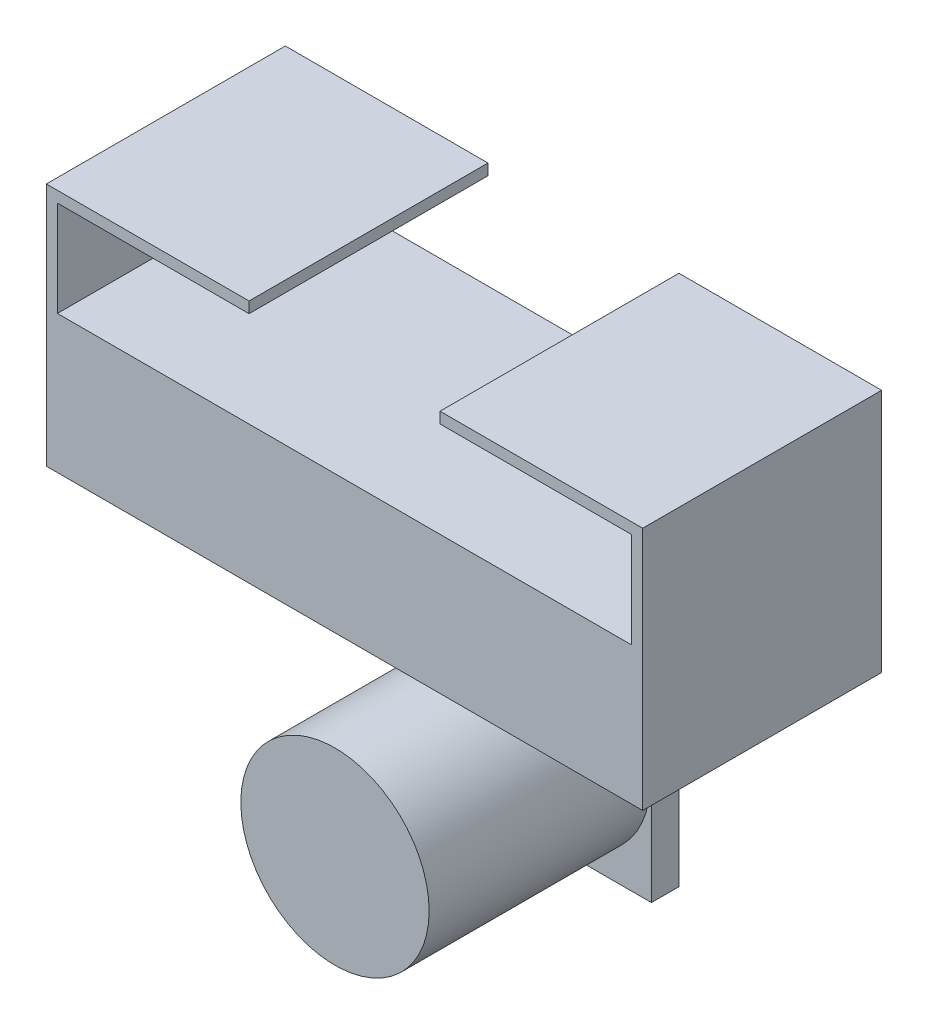
ISO-10303-21;
HEADER;
FILE_DESCRIPTION(('STEP AP214'),'2;1');
FILE_NAME('part.step','',(''),(''),'','','');
FILE_SCHEMA(('AUTOMOTIVE_DESIGN { 1 0 10303 214 1 1 1 1 }'));
ENDSEC;
DATA;
#1=APPLICATION_CONTEXT('core data for automotive mechanical design processes');
#2=APPLICATION_PROTOCOL_DEFINITION('international standard','automotive_design',2000,#1);
#3=PRODUCT_CONTEXT('',#1,'mechanical');
#4=PRODUCT('Part','Part','',(#3));
#5=PRODUCT_RELATED_PRODUCT_CATEGORY('part','',(#4));
#6=PRODUCT_DEFINITION_FORMATION('','',#4);
#7=PRODUCT_DEFINITION_CONTEXT('part definition',#1,'design');
#8=PRODUCT_DEFINITION('design','',#6,#7);
#9=PRODUCT_DEFINITION_SHAPE('','',#8);
#10=(LENGTH_UNIT() NAMED_UNIT(*) SI_UNIT(.MILLI.,.METRE.));
#11=(NAMED_UNIT(*) PLANE_ANGLE_UNIT() SI_UNIT($,.RADIAN.));
#12=(NAMED_UNIT(*) SI_UNIT($,.STERADIAN.) SOLID_ANGLE_UNIT());
#13=UNCERTAINTY_MEASURE_WITH_UNIT(LENGTH_MEASURE(1.E-05),#10,'distance_accuracy_value','');
#14=(GEOMETRIC_REPRESENTATION_CONTEXT(3) GLOBAL_UNCERTAINTY_ASSIGNED_CONTEXT((#13)) GLOBAL_UNIT_ASSIGNED_CONTEXT((#10,
#11,#12)) REPRESENTATION_CONTEXT('',''));
#15=CARTESIAN_POINT('',(0.,0.,0.));
#16=DIRECTION('',(0.,0.,1.));
#17=DIRECTION('',(1.,0.,0.));
#18=AXIS2_PLACEMENT_3D('',#15,#16,#17);
#19=CARTESIAN_POINT('',(-38.1508,24.4847083887015,0.));
#20=DIRECTION('',(1.,0.,0.));
#21=DIRECTION('',(0.,0.,-1.));
#22=AXIS2_PLACEMENT_3D('',#19,#20,#21);
#23=PLANE('',#22);
#24=DIRECTION('',(0.,1.,0.));
#25=VECTOR('',#24,1.);
#26=CARTESIAN_POINT('',(-38.1508,24.4847083887015,0.));
#27=LINE('',#26,#25);
#28=CARTESIAN_POINT('',(-38.1508,42.8009088680586,0.));
#29=VERTEX_POINT('',#28);
#30=CARTESIAN_POINT('',(-38.1508,55.5009088680586,0.));
#31=VERTEX_POINT('',#30);
#32=EDGE_CURVE('E924',#29,#31,#27,.T.);
#33=ORIENTED_EDGE('',*,*,#32,.T.);
#34=DIRECTION('',(0.,0.,1.));
#35=VECTOR('',#34,1.);
#36=CARTESIAN_POINT('',(-38.1508,55.5009088680586,0.));
#37=LINE('',#36,#35);
#38=CARTESIAN_POINT('',(-38.1508,55.5009088680586,31.75));
#39=VERTEX_POINT('',#38);
#40=EDGE_CURVE('E918',#31,#39,#37,.T.);
#41=ORIENTED_EDGE('',*,*,#40,.T.);
#42=DIRECTION('',(0.,1.,0.));
#43=VECTOR('',#42,1.);
#44=CARTESIAN_POINT('',(-38.1508,24.4847083887015,31.75));
#45=LINE('',#44,#43);
#46=CARTESIAN_POINT('',(-38.1508,42.8009088680586,31.75));
#47=VERTEX_POINT('',#46);
#48=EDGE_CURVE('E1037',#47,#39,#45,.T.);
#49=ORIENTED_EDGE('',*,*,#48,.F.);
#50=DIRECTION('',(0.,0.,1.));
#51=VECTOR('',#50,1.);
#52=CARTESIAN_POINT('',(-38.1508,42.8009088680586,0.));
#53=LINE('',#52,#51);
#54=EDGE_CURVE('E1133',#29,#47,#53,.T.);
#55=ORIENTED_EDGE('',*,*,#54,.F.);
#56=EDGE_LOOP('',(#33,#41,#49,#55));
#57=FACE_BOUND('',#56,.T.);
#58=ADVANCED_FACE('F904',(#57),#23,.T.);
#59=CARTESIAN_POINT('',(0.,0.,33.02));
#60=DIRECTION('',(0.,0.,-1.));
#61=DIRECTION('',(-1.,0.,0.));
#62=AXIS2_PLACEMENT_3D('',#59,#60,#61);
#63=CYLINDRICAL_SURFACE('',#62,12.512434661809);
#64=CARTESIAN_POINT('',(0.,0.,33.02));
#65=DIRECTION('',(0.,0.,1.));
#66=DIRECTION('',(1.,0.,0.));
#67=AXIS2_PLACEMENT_3D('',#64,#65,#66);
#68=CIRCLE('',#67,12.512434661809);
#69=CARTESIAN_POINT('',(12.512434661809,0.,33.02));
#70=VERTEX_POINT('',#69);
#71=EDGE_CURVE('E915',#70,#70,#68,.T.);
#72=ORIENTED_EDGE('',*,*,#71,.F.);
#73=EDGE_LOOP('',(#72));
#74=FACE_BOUND('',#73,.T.);
#75=CARTESIAN_POINT('',(0.,0.,3.66776));
#76=DIRECTION('',(0.,0.,-1.));
#77=DIRECTION('',(-1.,0.,0.));
#78=AXIS2_PLACEMENT_3D('',#75,#76,#77);
#79=CIRCLE('',#78,12.512434661809);
#80=CARTESIAN_POINT('',(-12.512434661809,0.,3.66776));
#81=VERTEX_POINT('',#80);
#82=EDGE_CURVE('E14',#81,#81,#79,.T.);
#83=ORIENTED_EDGE('',*,*,#82,.F.);
#84=EDGE_LOOP('',(#83));
#85=FACE_BOUND('',#84,.T.);
#86=ADVANCED_FACE('F903',(#74,#85),#63,.T.);
#87=CARTESIAN_POINT('',(0.,0.,33.02));
#88=DIRECTION('',(0.,0.,1.));
#89=DIRECTION('',(1.,0.,0.));
#90=AXIS2_PLACEMENT_3D('',#87,#88,#89);
#91=PLANE('',#90);
#92=ORIENTED_EDGE('',*,*,#71,.T.);
#93=EDGE_LOOP('',(#92));
#94=FACE_BOUND('',#93,.T.);
#95=ADVANCED_FACE('F1199',(#94),#91,.T.);
#96=CARTESIAN_POINT('',(12.7,24.4847083887015,3.66776));
#97=DIRECTION('',(1.,0.,0.));
#98=DIRECTION('',(0.,1.,0.));
#99=AXIS2_PLACEMENT_3D('',#96,#97,#98);
#100=PLANE('',#99);
#101=DIRECTION('',(0.,-1.,0.));
#102=VECTOR('',#101,1.);
#103=CARTESIAN_POINT('',(12.7,24.4847083887015,0.));
#104=LINE('',#103,#102);
#105=CARTESIAN_POINT('',(12.7,24.4847083887015,0.));
#106=VERTEX_POINT('',#105);
#107=CARTESIAN_POINT('',(12.7,-13.6152916112985,0.));
#108=VERTEX_POINT('',#107);
#109=EDGE_CURVE('E1151',#106,#108,#104,.T.);
#110=ORIENTED_EDGE('',*,*,#109,.F.);
#111=DIRECTION('',(0.,0.,-1.));
#112=VECTOR('',#111,1.);
#113=CARTESIAN_POINT('',(12.7,24.4847083887015,3.66776));
#114=LINE('',#113,#112);
#115=CARTESIAN_POINT('',(12.7,24.4847083887015,3.66776));
#116=VERTEX_POINT('',#115);
#117=EDGE_CURVE('E1183',#116,#106,#114,.T.);
#118=ORIENTED_EDGE('',*,*,#117,.F.);
#119=DIRECTION('',(0.,-1.,0.));
#120=VECTOR('',#119,1.);
#121=CARTESIAN_POINT('',(12.7,24.4847083887015,3.66776));
#122=LINE('',#121,#120);
#123=CARTESIAN_POINT('',(12.7,-13.6152916112985,3.66776));
#124=VERTEX_POINT('',#123);
#125=EDGE_CURVE('E1157',#116,#124,#122,.T.);
#126=ORIENTED_EDGE('',*,*,#125,.T.);
#127=DIRECTION('',(0.,0.,-1.));
#128=VECTOR('',#127,1.);
#129=CARTESIAN_POINT('',(12.7,-13.6152916112985,3.66776));
#130=LINE('',#129,#128);
#131=EDGE_CURVE('E1171',#124,#108,#130,.T.);
#132=ORIENTED_EDGE('',*,*,#131,.T.);
#133=EDGE_LOOP('',(#110,#118,#126,#132));
#134=FACE_BOUND('',#133,.T.);
#135=ADVANCED_FACE('F1226',(#134),#100,.T.);
#136=CARTESIAN_POINT('',(-12.7,-13.6152916112985,3.66776));
#137=DIRECTION('',(-1.,0.,0.));
#138=DIRECTION('',(0.,-1.,0.));
#139=AXIS2_PLACEMENT_3D('',#136,#137,#138);
#140=PLANE('',#139);
#141=DIRECTION('',(0.,1.,0.));
#142=VECTOR('',#141,1.);
#143=CARTESIAN_POINT('',(-12.7,-13.6152916112985,0.));
#144=LINE('',#143,#142);
#145=CARTESIAN_POINT('',(-12.7,-13.6152916112985,0.));
#146=VERTEX_POINT('',#145);
#147=CARTESIAN_POINT('',(-12.7,24.4847083887015,0.));
#148=VERTEX_POINT('',#147);
#149=EDGE_CURVE('E1164',#146,#148,#144,.T.);
#150=ORIENTED_EDGE('',*,*,#149,.F.);
#151=DIRECTION('',(0.,0.,-1.));
#152=VECTOR('',#151,1.);
#153=CARTESIAN_POINT('',(-12.7,-13.6152916112985,3.66776));
#154=LINE('',#153,#152);
#155=CARTESIAN_POINT('',(-12.7,-13.6152916112985,3.66776));
#156=VERTEX_POINT('',#155);
#157=EDGE_CURVE('E1195',#156,#146,#154,.T.);
#158=ORIENTED_EDGE('',*,*,#157,.F.);
#159=DIRECTION('',(0.,1.,0.));
#160=VECTOR('',#159,1.);
#161=CARTESIAN_POINT('',(-12.7,-13.6152916112985,3.66776));
#162=LINE('',#161,#160);
#163=CARTESIAN_POINT('',(-12.7,24.4847083887015,3.66776));
#164=VERTEX_POINT('',#163);
#165=EDGE_CURVE('E1166',#156,#164,#162,.T.);
#166=ORIENTED_EDGE('',*,*,#165,.T.);
#167=DIRECTION('',(0.,0.,-1.));
#168=VECTOR('',#167,1.);
#169=CARTESIAN_POINT('',(-12.7,24.4847083887015,3.66776));
#170=LINE('',#169,#168);
#171=EDGE_CURVE('E1188',#164,#148,#170,.T.);
#172=ORIENTED_EDGE('',*,*,#171,.T.);
#173=EDGE_LOOP('',(#150,#158,#166,#172));
#174=FACE_BOUND('',#173,.T.);
#175=ADVANCED_FACE('F1223',(#174),#140,.T.);
#176=CARTESIAN_POINT('',(12.7,-13.6152916112985,3.66776));
#177=DIRECTION('',(0.,-1.,0.));
#178=DIRECTION('',(1.,0.,0.));
#179=AXIS2_PLACEMENT_3D('',#176,#177,#178);
#180=PLANE('',#179);
#181=DIRECTION('',(-1.,0.,0.));
#182=VECTOR('',#181,1.);
#183=CARTESIAN_POINT('',(12.7,-13.6152916112985,0.));
#184=LINE('',#183,#182);
#185=EDGE_CURVE('E1177',#108,#146,#184,.T.);
#186=ORIENTED_EDGE('',*,*,#185,.F.);
#187=ORIENTED_EDGE('',*,*,#131,.F.);
#188=DIRECTION('',(-1.,0.,0.));
#189=VECTOR('',#188,1.);
#190=CARTESIAN_POINT('',(12.7,-13.6152916112985,3.66776));
#191=LINE('',#190,#189);
#192=EDGE_CURVE('E1165',#124,#156,#191,.T.);
#193=ORIENTED_EDGE('',*,*,#192,.T.);
#194=ORIENTED_EDGE('',*,*,#157,.T.);
#195=EDGE_LOOP('',(#186,#187,#193,#194));
#196=FACE_BOUND('',#195,.T.);
#197=ADVANCED_FACE('F1207',(#196),#180,.T.);
#198=CARTESIAN_POINT('',(0.,0.,3.66776));
#199=DIRECTION('',(0.,0.,-1.));
#200=DIRECTION('',(-1.,0.,0.));
#201=AXIS2_PLACEMENT_3D('',#198,#199,#200);
#202=PLANE('',#201);
#203=ORIENTED_EDGE('',*,*,#82,.T.);
#204=EDGE_LOOP('',(#203));
#205=FACE_BOUND('',#204,.T.);
#206=ORIENTED_EDGE('',*,*,#125,.F.);
#207=DIRECTION('',(1.,0.,0.));
#208=VECTOR('',#207,1.);
#209=CARTESIAN_POINT('',(-12.7,24.4847083887015,3.66776));
#210=LINE('',#209,#208);
#211=EDGE_CURVE('E1167',#164,#116,#210,.T.);
#212=ORIENTED_EDGE('',*,*,#211,.F.);
#213=ORIENTED_EDGE('',*,*,#165,.F.);
#214=ORIENTED_EDGE('',*,*,#192,.F.);
#215=EDGE_LOOP('',(#206,#212,#213,#214));
#216=FACE_BOUND('',#215,.T.);
#217=ADVANCED_FACE('F1208',(#205,#216),#202,.F.);
#218=CARTESIAN_POINT('',(0.,0.,0.));
#219=DIRECTION('',(0.,0.,1.));
#220=DIRECTION('',(1.,0.,0.));
#221=AXIS2_PLACEMENT_3D('',#218,#219,#220);
#222=PLANE('',#221);
#223=ORIENTED_EDGE('',*,*,#109,.T.);
#224=ORIENTED_EDGE('',*,*,#185,.T.);
#225=ORIENTED_EDGE('',*,*,#149,.T.);
#226=DIRECTION('',(-1.,0.,0.));
#227=VECTOR('',#226,1.);
#228=CARTESIAN_POINT('',(-38.1508,24.4847083887015,0.));
#229=LINE('',#228,#227);
#230=CARTESIAN_POINT('',(-39.6183555555556,24.4847083887015,0.));
#231=VERTEX_POINT('',#230);
#232=EDGE_CURVE('E1152',#148,#231,#229,.T.);
#233=ORIENTED_EDGE('',*,*,#232,.T.);
#234=DIRECTION('',(0.,-1.,0.));
#235=VECTOR('',#234,1.);
#236=CARTESIAN_POINT('',(-39.6183555555556,24.4847083887015,0.));
#237=LINE('',#236,#235);
#238=CARTESIAN_POINT('',(-39.6183555555556,56.9680128680586,0.));
#239=VERTEX_POINT('',#238);
#240=EDGE_CURVE('E1088',#239,#231,#237,.T.);
#241=ORIENTED_EDGE('',*,*,#240,.F.);
#242=DIRECTION('',(-1.,0.,0.));
#243=VECTOR('',#242,1.);
#244=CARTESIAN_POINT('',(-38.1508,56.9680128680586,0.));
#245=LINE('',#244,#243);
#246=CARTESIAN_POINT('',(-12.6873,56.9680128680586,0.));
#247=VERTEX_POINT('',#246);
#248=EDGE_CURVE('E1083',#247,#239,#245,.T.);
#249=ORIENTED_EDGE('',*,*,#248,.F.);
#250=DIRECTION('',(0.,1.,0.));
#251=VECTOR('',#250,1.);
#252=CARTESIAN_POINT('',(-12.6873,55.5009088680586,0.));
#253=LINE('',#252,#251);
#254=CARTESIAN_POINT('',(-12.6873,55.5009088680586,0.));
#255=VERTEX_POINT('',#254);
#256=EDGE_CURVE('E1027',#255,#247,#253,.T.);
#257=ORIENTED_EDGE('',*,*,#256,.F.);
#258=DIRECTION('',(-1.,0.,0.));
#259=VECTOR('',#258,1.);
#260=CARTESIAN_POINT('',(-38.1508,55.5009088680586,0.));
#261=LINE('',#260,#259);
#262=EDGE_CURVE('E1028',#255,#31,#261,.T.);
#263=ORIENTED_EDGE('',*,*,#262,.T.);
#264=ORIENTED_EDGE('',*,*,#32,.F.);
#265=DIRECTION('',(-1.,0.,0.));
#266=VECTOR('',#265,1.);
#267=CARTESIAN_POINT('',(-38.1508,42.8009088680586,0.));
#268=LINE('',#267,#266);
#269=CARTESIAN_POINT('',(38.1508,42.8009088680586,0.));
#270=VERTEX_POINT('',#269);
#271=EDGE_CURVE('E1150',#270,#29,#268,.T.);
#272=ORIENTED_EDGE('',*,*,#271,.F.);
#273=DIRECTION('',(0.,-1.,0.));
#274=VECTOR('',#273,1.);
#275=CARTESIAN_POINT('',(38.1508,24.4847083887015,0.));
#276=LINE('',#275,#274);
#277=CARTESIAN_POINT('',(38.1508,55.5009088680586,0.));
#278=VERTEX_POINT('',#277);
#279=EDGE_CURVE('E1118',#278,#270,#276,.T.);
#280=ORIENTED_EDGE('',*,*,#279,.F.);
#281=DIRECTION('',(-1.,0.,0.));
#282=VECTOR('',#281,1.);
#283=CARTESIAN_POINT('',(38.1508,55.5009088680586,0.));
#284=LINE('',#283,#282);
#285=CARTESIAN_POINT('',(12.6873,55.5009088680586,0.));
#286=VERTEX_POINT('',#285);
#287=EDGE_CURVE('E1075',#278,#286,#284,.T.);
#288=ORIENTED_EDGE('',*,*,#287,.T.);
#289=DIRECTION('',(0.,1.,0.));
#290=VECTOR('',#289,1.);
#291=CARTESIAN_POINT('',(12.6873,55.5009088680586,0.));
#292=LINE('',#291,#290);
#293=CARTESIAN_POINT('',(12.6873,56.9680128680586,0.));
#294=VERTEX_POINT('',#293);
#295=EDGE_CURVE('E1054',#286,#294,#292,.T.);
#296=ORIENTED_EDGE('',*,*,#295,.T.);
#297=DIRECTION('',(-1.,0.,0.));
#298=VECTOR('',#297,1.);
#299=CARTESIAN_POINT('',(38.1508,56.9680128680586,0.));
#300=LINE('',#299,#298);
#301=CARTESIAN_POINT('',(39.6183555555555,56.9680128680586,0.));
#302=VERTEX_POINT('',#301);
#303=EDGE_CURVE('E1112',#302,#294,#300,.T.);
#304=ORIENTED_EDGE('',*,*,#303,.F.);
#305=DIRECTION('',(0.,1.,0.));
#306=VECTOR('',#305,1.);
#307=CARTESIAN_POINT('',(39.6183555555555,24.4847083887015,0.));
#308=LINE('',#307,#306);
#309=CARTESIAN_POINT('',(39.6183555555555,24.4847083887015,0.));
#310=VERTEX_POINT('',#309);
#311=EDGE_CURVE('E1129',#310,#302,#308,.T.);
#312=ORIENTED_EDGE('',*,*,#311,.F.);
#313=EDGE_CURVE('E1140',#310,#106,#229,.T.);
#314=ORIENTED_EDGE('',*,*,#313,.T.);
#315=EDGE_LOOP('',(#223,#224,#225,#233,#241,#249,#257,#263,#264,#272,#280,#288,#296,#304,#312,#314));
#316=FACE_BOUND('',#315,.T.);
#317=ADVANCED_FACE('F1209',(#316),#222,.F.);
#318=CARTESIAN_POINT('',(-38.1508,42.8009088680586,31.75));
#319=DIRECTION('',(0.,0.,-1.));
#320=DIRECTION('',(-1.,0.,0.));
#321=AXIS2_PLACEMENT_3D('',#318,#319,#320);
#322=PLANE('',#321);
#323=DIRECTION('',(1.,0.,0.));
#324=VECTOR('',#323,1.);
#325=CARTESIAN_POINT('',(-38.1508,24.4847083887015,31.75));
#326=LINE('',#325,#324);
#327=CARTESIAN_POINT('',(-39.6183555555556,24.4847083887015,31.75));
#328=VERTEX_POINT('',#327);
#329=CARTESIAN_POINT('',(39.6183555555555,24.4847083887015,31.75));
#330=VERTEX_POINT('',#329);
#331=EDGE_CURVE('E1107',#328,#330,#326,.T.);
#332=ORIENTED_EDGE('',*,*,#331,.T.);
#333=DIRECTION('',(0.,1.,0.));
#334=VECTOR('',#333,1.);
#335=CARTESIAN_POINT('',(39.6183555555555,24.4847083887015,31.75));
#336=LINE('',#335,#334);
#337=CARTESIAN_POINT('',(39.6183555555555,56.9680128680586,31.75));
#338=VERTEX_POINT('',#337);
#339=EDGE_CURVE('E1119',#330,#338,#336,.T.);
#340=ORIENTED_EDGE('',*,*,#339,.T.);
#341=DIRECTION('',(-1.,0.,0.));
#342=VECTOR('',#341,1.);
#343=CARTESIAN_POINT('',(38.1508,56.9680128680586,31.75));
#344=LINE('',#343,#342);
#345=CARTESIAN_POINT('',(12.6873,56.9680128680586,31.75));
#346=VERTEX_POINT('',#345);
#347=EDGE_CURVE('E1117',#338,#346,#344,.T.);
#348=ORIENTED_EDGE('',*,*,#347,.T.);
#349=DIRECTION('',(0.,1.,0.));
#350=VECTOR('',#349,1.);
#351=CARTESIAN_POINT('',(12.6873,55.5009088680586,31.75));
#352=LINE('',#351,#350);
#353=CARTESIAN_POINT('',(12.6873,55.5009088680586,31.75));
#354=VERTEX_POINT('',#353);
#355=EDGE_CURVE('E1058',#354,#346,#352,.T.);
#356=ORIENTED_EDGE('',*,*,#355,.F.);
#357=DIRECTION('',(1.,0.,0.));
#358=VECTOR('',#357,1.);
#359=CARTESIAN_POINT('',(38.1508,55.5009088680586,31.75));
#360=LINE('',#359,#358);
#361=CARTESIAN_POINT('',(38.1508,55.5009088680586,31.75));
#362=VERTEX_POINT('',#361);
#363=EDGE_CURVE('E1060',#354,#362,#360,.T.);
#364=ORIENTED_EDGE('',*,*,#363,.T.);
#365=DIRECTION('',(0.,-1.,0.));
#366=VECTOR('',#365,1.);
#367=CARTESIAN_POINT('',(38.1508,24.4847083887015,31.75));
#368=LINE('',#367,#366);
#369=CARTESIAN_POINT('',(38.1508,42.8009088680586,31.75));
#370=VERTEX_POINT('',#369);
#371=EDGE_CURVE('E1097',#362,#370,#368,.T.);
#372=ORIENTED_EDGE('',*,*,#371,.T.);
#373=DIRECTION('',(1.,0.,0.));
#374=VECTOR('',#373,1.);
#375=CARTESIAN_POINT('',(-38.1508,42.8009088680586,31.75));
#376=LINE('',#375,#374);
#377=EDGE_CURVE('E1136',#47,#370,#376,.T.);
#378=ORIENTED_EDGE('',*,*,#377,.F.);
#379=ORIENTED_EDGE('',*,*,#48,.T.);
#380=DIRECTION('',(1.,0.,0.));
#381=VECTOR('',#380,1.);
#382=CARTESIAN_POINT('',(-38.1508,55.5009088680586,31.75));
#383=LINE('',#382,#381);
#384=CARTESIAN_POINT('',(-12.6873,55.5009088680586,31.75));
#385=VERTEX_POINT('',#384);
#386=EDGE_CURVE('E1031',#39,#385,#383,.T.);
#387=ORIENTED_EDGE('',*,*,#386,.T.);
#388=DIRECTION('',(0.,1.,0.));
#389=VECTOR('',#388,1.);
#390=CARTESIAN_POINT('',(-12.6873,55.5009088680586,31.75));
#391=LINE('',#390,#389);
#392=CARTESIAN_POINT('',(-12.6873,56.9680128680586,31.75));
#393=VERTEX_POINT('',#392);
#394=EDGE_CURVE('E1016',#385,#393,#391,.T.);
#395=ORIENTED_EDGE('',*,*,#394,.T.);
#396=DIRECTION('',(-1.,0.,0.));
#397=VECTOR('',#396,1.);
#398=CARTESIAN_POINT('',(-38.1508,56.9680128680586,31.75));
#399=LINE('',#398,#397);
#400=CARTESIAN_POINT('',(-39.6183555555556,56.9680128680586,31.75));
#401=VERTEX_POINT('',#400);
#402=EDGE_CURVE('E1094',#393,#401,#399,.T.);
#403=ORIENTED_EDGE('',*,*,#402,.T.);
#404=DIRECTION('',(0.,-1.,0.));
#405=VECTOR('',#404,1.);
#406=CARTESIAN_POINT('',(-39.6183555555556,24.4847083887015,31.75));
#407=LINE('',#406,#405);
#408=EDGE_CURVE('E1082',#401,#328,#407,.T.);
#409=ORIENTED_EDGE('',*,*,#408,.T.);
#410=EDGE_LOOP('',(#332,#340,#348,#356,#364,#372,#378,#379,#387,#395,#403,#409));
#411=FACE_BOUND('',#410,.T.);
#412=ADVANCED_FACE('F1040',(#411),#322,.F.);
#413=CARTESIAN_POINT('',(0.,42.8009088680586,0.));
#414=DIRECTION('',(0.,1.,0.));
#415=DIRECTION('',(-1.,0.,0.));
#416=AXIS2_PLACEMENT_3D('',#413,#414,#415);
#417=PLANE('',#416);
#418=ORIENTED_EDGE('',*,*,#54,.T.);
#419=ORIENTED_EDGE('',*,*,#377,.T.);
#420=DIRECTION('',(0.,0.,-1.));
#421=VECTOR('',#420,1.);
#422=CARTESIAN_POINT('',(38.1508,42.8009088680586,0.));
#423=LINE('',#422,#421);
#424=EDGE_CURVE('E1141',#370,#270,#423,.T.);
#425=ORIENTED_EDGE('',*,*,#424,.T.);
#426=ORIENTED_EDGE('',*,*,#271,.T.);
#427=EDGE_LOOP('',(#418,#419,#425,#426));
#428=FACE_BOUND('',#427,.T.);
#429=ADVANCED_FACE('F1262',(#428),#417,.T.);
#430=CARTESIAN_POINT('',(0.,24.4847083887015,0.));
#431=DIRECTION('',(0.,1.,0.));
#432=DIRECTION('',(-1.,0.,0.));
#433=AXIS2_PLACEMENT_3D('',#430,#431,#432);
#434=PLANE('',#433);
#435=ORIENTED_EDGE('',*,*,#171,.F.);
#436=ORIENTED_EDGE('',*,*,#211,.T.);
#437=ORIENTED_EDGE('',*,*,#117,.T.);
#438=ORIENTED_EDGE('',*,*,#313,.F.);
#439=DIRECTION('',(0.,0.,1.));
#440=VECTOR('',#439,1.);
#441=CARTESIAN_POINT('',(39.6183555555555,24.4847083887015,0.));
#442=LINE('',#441,#440);
#443=EDGE_CURVE('E1106',#310,#330,#442,.T.);
#444=ORIENTED_EDGE('',*,*,#443,.T.);
#445=ORIENTED_EDGE('',*,*,#331,.F.);
#446=DIRECTION('',(0.,0.,1.));
#447=VECTOR('',#446,1.);
#448=CARTESIAN_POINT('',(-39.6183555555556,24.4847083887015,0.));
#449=LINE('',#448,#447);
#450=EDGE_CURVE('E1101',#231,#328,#449,.T.);
#451=ORIENTED_EDGE('',*,*,#450,.F.);
#452=ORIENTED_EDGE('',*,*,#232,.F.);
#453=EDGE_LOOP('',(#435,#436,#437,#438,#444,#445,#451,#452));
#454=FACE_BOUND('',#453,.T.);
#455=ADVANCED_FACE('F1217',(#454),#434,.F.);
#456=CARTESIAN_POINT('',(38.1508,24.4847083887015,0.));
#457=DIRECTION('',(-1.,0.,0.));
#458=DIRECTION('',(0.,-1.,0.));
#459=AXIS2_PLACEMENT_3D('',#456,#457,#458);
#460=PLANE('',#459);
#461=DIRECTION('',(0.,0.,-1.));
#462=VECTOR('',#461,1.);
#463=CARTESIAN_POINT('',(38.1508,55.5009088680586,0.));
#464=LINE('',#463,#462);
#465=EDGE_CURVE('E1066',#362,#278,#464,.T.);
#466=ORIENTED_EDGE('',*,*,#465,.T.);
#467=ORIENTED_EDGE('',*,*,#279,.T.);
#468=ORIENTED_EDGE('',*,*,#424,.F.);
#469=ORIENTED_EDGE('',*,*,#371,.F.);
#470=EDGE_LOOP('',(#466,#467,#468,#469));
#471=FACE_BOUND('',#470,.T.);
#472=ADVANCED_FACE('F1248',(#471),#460,.T.);
#473=CARTESIAN_POINT('',(38.1508,56.9680128680586,0.));
#474=DIRECTION('',(0.,1.,0.));
#475=DIRECTION('',(0.,0.,1.));
#476=AXIS2_PLACEMENT_3D('',#473,#474,#475);
#477=PLANE('',#476);
#478=ORIENTED_EDGE('',*,*,#347,.F.);
#479=DIRECTION('',(0.,0.,1.));
#480=VECTOR('',#479,1.);
#481=CARTESIAN_POINT('',(39.6183555555555,56.9680128680586,0.));
#482=LINE('',#481,#480);
#483=EDGE_CURVE('E1055',#302,#338,#482,.T.);
#484=ORIENTED_EDGE('',*,*,#483,.F.);
#485=ORIENTED_EDGE('',*,*,#303,.T.);
#486=DIRECTION('',(0.,0.,1.));
#487=VECTOR('',#486,1.);
#488=CARTESIAN_POINT('',(12.6873,56.9680128680586,0.));
#489=LINE('',#488,#487);
#490=EDGE_CURVE('E1049',#294,#346,#489,.T.);
#491=ORIENTED_EDGE('',*,*,#490,.T.);
#492=EDGE_LOOP('',(#478,#484,#485,#491));
#493=FACE_BOUND('',#492,.T.);
#494=ADVANCED_FACE('F1255',(#493),#477,.T.);
#495=CARTESIAN_POINT('',(39.6183555555555,24.4847083887015,0.));
#496=DIRECTION('',(1.,0.,0.));
#497=DIRECTION('',(0.,0.,-1.));
#498=AXIS2_PLACEMENT_3D('',#495,#496,#497);
#499=PLANE('',#498);
#500=ORIENTED_EDGE('',*,*,#339,.F.);
#501=ORIENTED_EDGE('',*,*,#443,.F.);
#502=ORIENTED_EDGE('',*,*,#311,.T.);
#503=ORIENTED_EDGE('',*,*,#483,.T.);
#504=EDGE_LOOP('',(#500,#501,#502,#503));
#505=FACE_BOUND('',#504,.T.);
#506=ADVANCED_FACE('F1252',(#505),#499,.T.);
#507=CARTESIAN_POINT('',(-39.6183555555556,24.4847083887015,0.));
#508=DIRECTION('',(-1.,0.,0.));
#509=DIRECTION('',(0.,0.,1.));
#510=AXIS2_PLACEMENT_3D('',#507,#508,#509);
#511=PLANE('',#510);
#512=ORIENTED_EDGE('',*,*,#408,.F.);
#513=DIRECTION('',(0.,0.,1.));
#514=VECTOR('',#513,1.);
#515=CARTESIAN_POINT('',(-39.6183555555556,56.9680128680586,0.));
#516=LINE('',#515,#514);
#517=EDGE_CURVE('E1095',#239,#401,#516,.T.);
#518=ORIENTED_EDGE('',*,*,#517,.F.);
#519=ORIENTED_EDGE('',*,*,#240,.T.);
#520=ORIENTED_EDGE('',*,*,#450,.T.);
#521=EDGE_LOOP('',(#512,#518,#519,#520));
#522=FACE_BOUND('',#521,.T.);
#523=ADVANCED_FACE('F1259',(#522),#511,.T.);
#524=CARTESIAN_POINT('',(-38.1508,56.9680128680586,0.));
#525=DIRECTION('',(0.,1.,0.));
#526=DIRECTION('',(0.,0.,1.));
#527=AXIS2_PLACEMENT_3D('',#524,#525,#526);
#528=PLANE('',#527);
#529=ORIENTED_EDGE('',*,*,#402,.F.);
#530=DIRECTION('',(0.,0.,-1.));
#531=VECTOR('',#530,1.);
#532=CARTESIAN_POINT('',(-12.6873,56.9680128680586,0.));
#533=LINE('',#532,#531);
#534=EDGE_CURVE('E1023',#393,#247,#533,.T.);
#535=ORIENTED_EDGE('',*,*,#534,.T.);
#536=ORIENTED_EDGE('',*,*,#248,.T.);
#537=ORIENTED_EDGE('',*,*,#517,.T.);
#538=EDGE_LOOP('',(#529,#535,#536,#537));
#539=FACE_BOUND('',#538,.T.);
#540=ADVANCED_FACE('F1246',(#539),#528,.T.);
#541=CARTESIAN_POINT('',(-12.6873,55.5009088680586,0.));
#542=DIRECTION('',(1.,0.,0.));
#543=DIRECTION('',(0.,0.,-1.));
#544=AXIS2_PLACEMENT_3D('',#541,#542,#543);
#545=PLANE('',#544);
#546=ORIENTED_EDGE('',*,*,#534,.F.);
#547=ORIENTED_EDGE('',*,*,#394,.F.);
#548=DIRECTION('',(0.,0.,-1.));
#549=VECTOR('',#548,1.);
#550=CARTESIAN_POINT('',(-12.6873,55.5009088680586,0.));
#551=LINE('',#550,#549);
#552=EDGE_CURVE('E1019',#385,#255,#551,.T.);
#553=ORIENTED_EDGE('',*,*,#552,.T.);
#554=ORIENTED_EDGE('',*,*,#256,.T.);
#555=EDGE_LOOP('',(#546,#547,#553,#554));
#556=FACE_BOUND('',#555,.T.);
#557=ADVANCED_FACE('F1018',(#556),#545,.T.);
#558=CARTESIAN_POINT('',(0.,55.5009088680586,0.));
#559=DIRECTION('',(0.,1.,0.));
#560=DIRECTION('',(0.,0.,1.));
#561=AXIS2_PLACEMENT_3D('',#558,#559,#560);
#562=PLANE('',#561);
#563=ORIENTED_EDGE('',*,*,#40,.F.);
#564=ORIENTED_EDGE('',*,*,#262,.F.);
#565=ORIENTED_EDGE('',*,*,#552,.F.);
#566=ORIENTED_EDGE('',*,*,#386,.F.);
#567=EDGE_LOOP('',(#563,#564,#565,#566));
#568=FACE_BOUND('',#567,.T.);
#569=ADVANCED_FACE('F1034',(#568),#562,.F.);
#570=CARTESIAN_POINT('',(12.6873,55.5009088680586,0.));
#571=DIRECTION('',(-1.,0.,0.));
#572=DIRECTION('',(0.,0.,1.));
#573=AXIS2_PLACEMENT_3D('',#570,#571,#572);
#574=PLANE('',#573);
#575=ORIENTED_EDGE('',*,*,#490,.F.);
#576=ORIENTED_EDGE('',*,*,#295,.F.);
#577=DIRECTION('',(0.,0.,1.));
#578=VECTOR('',#577,1.);
#579=CARTESIAN_POINT('',(12.6873,55.5009088680586,0.));
#580=LINE('',#579,#578);
#581=EDGE_CURVE('E1069',#286,#354,#580,.T.);
#582=ORIENTED_EDGE('',*,*,#581,.T.);
#583=ORIENTED_EDGE('',*,*,#355,.T.);
#584=EDGE_LOOP('',(#575,#576,#582,#583));
#585=FACE_BOUND('',#584,.T.);
#586=ADVANCED_FACE('F1392',(#585),#574,.T.);
#587=CARTESIAN_POINT('',(0.,55.5009088680586,0.));
#588=DIRECTION('',(0.,-1.,0.));
#589=DIRECTION('',(0.,0.,-1.));
#590=AXIS2_PLACEMENT_3D('',#587,#588,#589);
#591=PLANE('',#590);
#592=ORIENTED_EDGE('',*,*,#465,.F.);
#593=ORIENTED_EDGE('',*,*,#363,.F.);
#594=ORIENTED_EDGE('',*,*,#581,.F.);
#595=ORIENTED_EDGE('',*,*,#287,.F.);
#596=EDGE_LOOP('',(#592,#593,#594,#595));
#597=FACE_BOUND('',#596,.T.);
#598=ADVANCED_FACE('F1403',(#597),#591,.T.);
#599=CLOSED_SHELL('',(#58,#86,#95,#135,#175,#197,#217,#317,#412,#429,#455,#472,#494,#506,#523,
#540,#557,#569,#586,#598));
#600=MANIFOLD_SOLID_BREP('B2',#599);
#601=ADVANCED_BREP_SHAPE_REPRESENTATION('',(#18,#600),#14);
#602=SHAPE_DEFINITION_REPRESENTATION(#9,#601);
ENDSEC;
END-ISO-10303-21;
